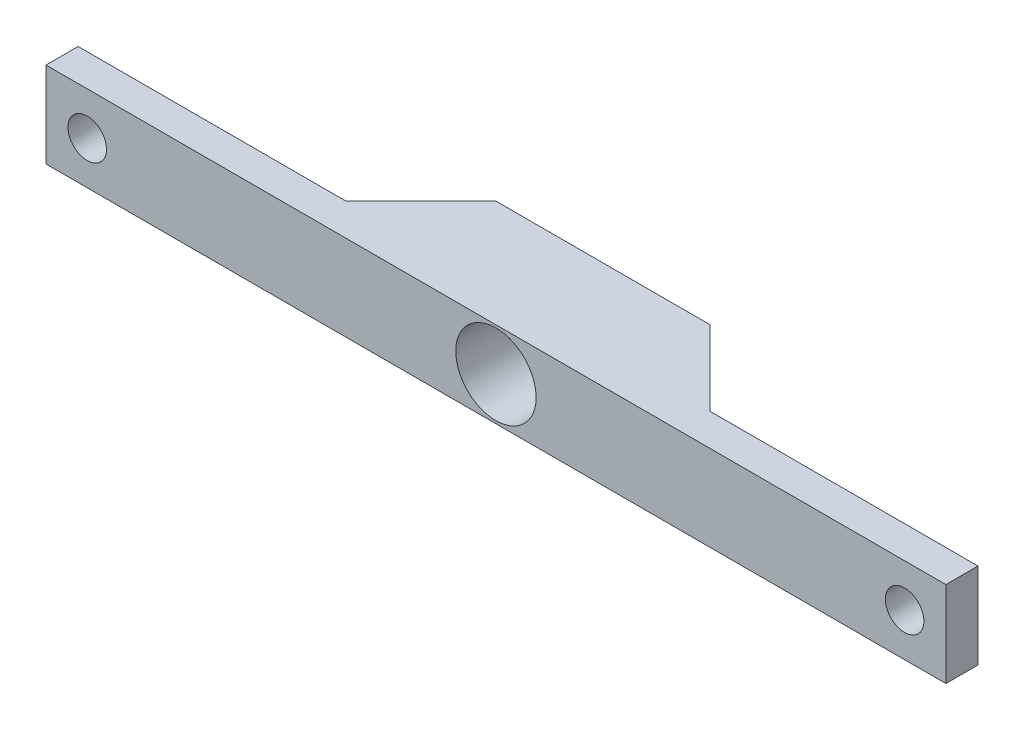
ISO-10303-21;
HEADER;
FILE_DESCRIPTION(('STEP AP214'),'2;1');
FILE_NAME('part.step','',(''),(''),'','','');
FILE_SCHEMA(('AUTOMOTIVE_DESIGN { 1 0 10303 214 1 1 1 1 }'));
ENDSEC;
DATA;
#1=APPLICATION_CONTEXT('core data for automotive mechanical design processes');
#2=APPLICATION_PROTOCOL_DEFINITION('international standard','automotive_design',2000,#1);
#3=PRODUCT_CONTEXT('',#1,'mechanical');
#4=PRODUCT('Part','Part','',(#3));
#5=PRODUCT_RELATED_PRODUCT_CATEGORY('part','',(#4));
#6=PRODUCT_DEFINITION_FORMATION('','',#4);
#7=PRODUCT_DEFINITION_CONTEXT('part definition',#1,'design');
#8=PRODUCT_DEFINITION('design','',#6,#7);
#9=PRODUCT_DEFINITION_SHAPE('','',#8);
#10=(LENGTH_UNIT() NAMED_UNIT(*) SI_UNIT(.MILLI.,.METRE.));
#11=(NAMED_UNIT(*) PLANE_ANGLE_UNIT() SI_UNIT($,.RADIAN.));
#12=(NAMED_UNIT(*) SI_UNIT($,.STERADIAN.) SOLID_ANGLE_UNIT());
#13=UNCERTAINTY_MEASURE_WITH_UNIT(LENGTH_MEASURE(1.E-05),#10,'distance_accuracy_value','');
#14=(GEOMETRIC_REPRESENTATION_CONTEXT(3) GLOBAL_UNCERTAINTY_ASSIGNED_CONTEXT((#13)) GLOBAL_UNIT_ASSIGNED_CONTEXT((#10,
#11,#12)) REPRESENTATION_CONTEXT('',''));
#15=CARTESIAN_POINT('',(0.,0.,0.));
#16=DIRECTION('',(0.,0.,1.));
#17=DIRECTION('',(1.,0.,0.));
#18=AXIS2_PLACEMENT_3D('',#15,#16,#17);
#19=CARTESIAN_POINT('',(0.,4.,10.));
#20=DIRECTION('',(0.,0.,-1.));
#21=DIRECTION('',(-1.,0.,0.));
#22=AXIS2_PLACEMENT_3D('',#19,#20,#21);
#23=CYLINDRICAL_SURFACE('',#22,1.8);
#24=CARTESIAN_POINT('',(0.,4.,0.));
#25=DIRECTION('',(0.,0.,-1.));
#26=DIRECTION('',(-1.,0.,0.));
#27=AXIS2_PLACEMENT_3D('',#24,#25,#26);
#28=CIRCLE('',#27,1.8);
#29=CARTESIAN_POINT('',(-1.8,4.,0.));
#30=VERTEX_POINT('',#29);
#31=EDGE_CURVE('E313',#30,#30,#28,.T.);
#32=CARTESIAN_POINT('',(0.,4.,4.));
#33=DIRECTION('',(0.,0.,1.));
#34=DIRECTION('',(1.,0.,0.));
#35=AXIS2_PLACEMENT_3D('',#32,#33,#34);
#36=CIRCLE('',#35,1.8);
#37=CARTESIAN_POINT('',(-1.8,4.,4.));
#38=VERTEX_POINT('',#37);
#39=EDGE_CURVE('E38',#38,#38,#36,.F.);
#40=CARTESIAN_POINT('',(-1.8,4.,0.));
#41=CARTESIAN_POINT('',(-1.8,4.,0.0416666666666667));
#42=CARTESIAN_POINT('',(-1.8,4.,0.0833333333333334));
#43=CARTESIAN_POINT('',(-1.8,4.,0.166666666666667));
#44=CARTESIAN_POINT('',(-1.8,4.,0.208333333333334));
#45=CARTESIAN_POINT('',(-1.8,4.,0.291666666666667));
#46=CARTESIAN_POINT('',(-1.8,4.,0.333333333333334));
#47=CARTESIAN_POINT('',(-1.8,4.,0.416666666666667));
#48=CARTESIAN_POINT('',(-1.8,4.,0.458333333333334));
#49=CARTESIAN_POINT('',(-1.8,4.,0.541666666666667));
#50=CARTESIAN_POINT('',(-1.8,4.,0.583333333333334));
#51=CARTESIAN_POINT('',(-1.8,4.,0.666666666666667));
#52=CARTESIAN_POINT('',(-1.8,4.,0.708333333333334));
#53=CARTESIAN_POINT('',(-1.8,4.,0.791666666666667));
#54=CARTESIAN_POINT('',(-1.8,4.,0.833333333333334));
#55=CARTESIAN_POINT('',(-1.8,4.,0.916666666666668));
#56=CARTESIAN_POINT('',(-1.8,4.,0.958333333333334));
#57=CARTESIAN_POINT('',(-1.8,4.,1.04166666666667));
#58=CARTESIAN_POINT('',(-1.8,4.,1.08333333333333));
#59=CARTESIAN_POINT('',(-1.8,4.,1.16666666666667));
#60=CARTESIAN_POINT('',(-1.8,4.,1.20833333333333));
#61=CARTESIAN_POINT('',(-1.8,4.,1.29166666666667));
#62=CARTESIAN_POINT('',(-1.8,4.,1.33333333333333));
#63=CARTESIAN_POINT('',(-1.8,4.,1.41666666666667));
#64=CARTESIAN_POINT('',(-1.8,4.,1.45833333333333));
#65=CARTESIAN_POINT('',(-1.8,4.,1.54166666666667));
#66=CARTESIAN_POINT('',(-1.8,4.,1.58333333333333));
#67=CARTESIAN_POINT('',(-1.8,4.,1.66666666666667));
#68=CARTESIAN_POINT('',(-1.8,4.,1.70833333333333));
#69=CARTESIAN_POINT('',(-1.8,4.,1.79166666666667));
#70=CARTESIAN_POINT('',(-1.8,4.,1.83333333333334));
#71=CARTESIAN_POINT('',(-1.8,4.,1.91666666666667));
#72=CARTESIAN_POINT('',(-1.8,4.,1.95833333333334));
#73=CARTESIAN_POINT('',(-1.8,4.,2.04166666666667));
#74=CARTESIAN_POINT('',(-1.8,4.,2.08333333333334));
#75=CARTESIAN_POINT('',(-1.8,4.,2.16666666666667));
#76=CARTESIAN_POINT('',(-1.8,4.,2.20833333333333));
#77=CARTESIAN_POINT('',(-1.8,4.,2.29166666666667));
#78=CARTESIAN_POINT('',(-1.8,4.,2.33333333333333));
#79=CARTESIAN_POINT('',(-1.8,4.,2.41666666666667));
#80=CARTESIAN_POINT('',(-1.8,4.,2.45833333333333));
#81=CARTESIAN_POINT('',(-1.8,4.,2.54166666666667));
#82=CARTESIAN_POINT('',(-1.8,4.,2.58333333333333));
#83=CARTESIAN_POINT('',(-1.8,4.,2.66666666666667));
#84=CARTESIAN_POINT('',(-1.8,4.,2.70833333333333));
#85=CARTESIAN_POINT('',(-1.8,4.,2.79166666666667));
#86=CARTESIAN_POINT('',(-1.8,4.,2.83333333333333));
#87=CARTESIAN_POINT('',(-1.8,4.,2.91666666666667));
#88=CARTESIAN_POINT('',(-1.8,4.,2.95833333333333));
#89=CARTESIAN_POINT('',(-1.8,4.,3.04166666666667));
#90=CARTESIAN_POINT('',(-1.8,4.,3.08333333333334));
#91=CARTESIAN_POINT('',(-1.8,4.,3.16666666666667));
#92=CARTESIAN_POINT('',(-1.8,4.,3.20833333333334));
#93=CARTESIAN_POINT('',(-1.8,4.,3.29166666666667));
#94=CARTESIAN_POINT('',(-1.8,4.,3.33333333333334));
#95=CARTESIAN_POINT('',(-1.8,4.,3.41666666666667));
#96=CARTESIAN_POINT('',(-1.8,4.,3.45833333333334));
#97=CARTESIAN_POINT('',(-1.8,4.,3.54166666666667));
#98=CARTESIAN_POINT('',(-1.8,4.,3.58333333333334));
#99=CARTESIAN_POINT('',(-1.8,4.,3.66666666666667));
#100=CARTESIAN_POINT('',(-1.8,4.,3.70833333333334));
#101=CARTESIAN_POINT('',(-1.8,4.,3.79166666666667));
#102=CARTESIAN_POINT('',(-1.8,4.,3.83333333333334));
#103=CARTESIAN_POINT('',(-1.8,4.,3.91666666666667));
#104=CARTESIAN_POINT('',(-1.8,4.,3.95833333333334));
#105=CARTESIAN_POINT('',(-1.8,4.,4.));
#106=B_SPLINE_CURVE_WITH_KNOTS('',3,(#40,#41,#42,#43,#44,#45,#46,#47,#48,#49,#50,#51,#52,#53,
#54,#55,#56,#57,#58,#59,#60,#61,#62,#63,#64,#65,#66,#67,#68,#69,#70,#71,#72,#73,#74,#75,#76,#77,
#78,#79,#80,#81,#82,#83,#84,#85,#86,#87,#88,#89,#90,#91,#92,#93,#94,#95,#96,#97,#98,#99,#100,
#101,#102,#103,#104,#105),.UNSPECIFIED.,.F.,.F.,(4,2,2,2,2,2,2,2,2,2,2,2,2,2,2,2,2,2,2,2,2,2,2,
2,2,2,2,2,2,2,2,2,4),(0.,0.125,0.25,0.375,0.5,0.625000000000001,0.750000000000001,
0.875000000000001,1.,1.125,1.25,1.375,1.5,1.625,1.75,1.875,2.,2.125,2.25,2.375,2.5,2.625,2.75,
2.875,3.,3.125,3.25,3.375,3.5,3.625,3.75,3.875,4.),.UNSPECIFIED.);
#107=EDGE_CURVE('BSEAM34',#30,#38,#106,.T.);
#108=ORIENTED_EDGE('',*,*,#31,.T.);
#109=ORIENTED_EDGE('',*,*,#39,.F.);
#110=ORIENTED_EDGE('',*,*,#107,.T.);
#111=ORIENTED_EDGE('',*,*,#107,.F.);
#112=EDGE_LOOP('',(#108,#110,#109,#111));
#113=FACE_BOUND('',#112,.T.);
#114=ADVANCED_FACE('F34',(#113),#23,.F.);
#115=CARTESIAN_POINT('',(20.,8.,10.));
#116=DIRECTION('',(0.,0.,-1.));
#117=DIRECTION('',(-1.,0.,0.));
#118=AXIS2_PLACEMENT_3D('',#115,#116,#117);
#119=PLANE('',#118);
#120=CARTESIAN_POINT('',(0.,4.,10.));
#121=DIRECTION('',(0.,0.,1.));
#122=DIRECTION('',(1.,0.,0.));
#123=AXIS2_PLACEMENT_3D('',#120,#121,#122);
#124=CIRCLE('',#123,3.75);
#125=CARTESIAN_POINT('',(3.75,4.,10.));
#126=VERTEX_POINT('',#125);
#127=EDGE_CURVE('E309',#126,#126,#124,.T.);
#128=ORIENTED_EDGE('',*,*,#127,.F.);
#129=EDGE_LOOP('',(#128));
#130=FACE_BOUND('',#129,.T.);
#131=CARTESIAN_POINT('',(-38.15,4.,10.));
#132=DIRECTION('',(0.,0.,1.));
#133=DIRECTION('',(1.,0.,0.));
#134=AXIS2_PLACEMENT_3D('',#131,#132,#133);
#135=CIRCLE('',#134,1.8);
#136=CARTESIAN_POINT('',(-36.35,4.,10.));
#137=VERTEX_POINT('',#136);
#138=EDGE_CURVE('E169',#137,#137,#135,.T.);
#139=ORIENTED_EDGE('',*,*,#138,.F.);
#140=EDGE_LOOP('',(#139));
#141=FACE_BOUND('',#140,.T.);
#142=CARTESIAN_POINT('',(38.15,4.,10.));
#143=DIRECTION('',(0.,0.,1.));
#144=DIRECTION('',(1.,0.,0.));
#145=AXIS2_PLACEMENT_3D('',#142,#143,#144);
#146=CIRCLE('',#145,1.8);
#147=CARTESIAN_POINT('',(39.95,4.,10.));
#148=VERTEX_POINT('',#147);
#149=EDGE_CURVE('E131',#148,#148,#146,.T.);
#150=ORIENTED_EDGE('',*,*,#149,.F.);
#151=EDGE_LOOP('',(#150));
#152=FACE_BOUND('',#151,.T.);
#153=DIRECTION('',(1.,0.,0.));
#154=VECTOR('',#153,1.);
#155=CARTESIAN_POINT('',(20.,0.,10.));
#156=LINE('',#155,#154);
#157=CARTESIAN_POINT('',(-42.,0.,10.));
#158=VERTEX_POINT('',#157);
#159=CARTESIAN_POINT('',(42.,0.,10.));
#160=VERTEX_POINT('',#159);
#161=EDGE_CURVE('E150',#158,#160,#156,.T.);
#162=ORIENTED_EDGE('',*,*,#161,.T.);
#163=DIRECTION('',(0.,1.,0.));
#164=VECTOR('',#163,1.);
#165=CARTESIAN_POINT('',(42.,0.,10.));
#166=LINE('',#165,#164);
#167=CARTESIAN_POINT('',(42.,8.00000000000001,10.));
#168=VERTEX_POINT('',#167);
#169=EDGE_CURVE('E128',#160,#168,#166,.T.);
#170=ORIENTED_EDGE('',*,*,#169,.T.);
#171=DIRECTION('',(1.,0.,0.));
#172=VECTOR('',#171,1.);
#173=CARTESIAN_POINT('',(20.,8.,10.));
#174=LINE('',#173,#172);
#175=CARTESIAN_POINT('',(-42.,8.,10.));
#176=VERTEX_POINT('',#175);
#177=EDGE_CURVE('E105',#176,#168,#174,.T.);
#178=ORIENTED_EDGE('',*,*,#177,.F.);
#179=DIRECTION('',(0.,-1.,0.));
#180=VECTOR('',#179,1.);
#181=CARTESIAN_POINT('',(-42.,0.,10.));
#182=LINE('',#181,#180);
#183=EDGE_CURVE('E125',#176,#158,#182,.T.);
#184=ORIENTED_EDGE('',*,*,#183,.T.);
#185=EDGE_LOOP('',(#162,#170,#178,#184));
#186=FACE_BOUND('',#185,.T.);
#187=ADVANCED_FACE('F36',(#130,#141,#152,#186),#119,.F.);
#188=CARTESIAN_POINT('',(10.,8.,0.));
#189=DIRECTION('',(-0.707106781186549,0.,0.707106781186547));
#190=DIRECTION('',(0.707106781186547,0.,0.707106781186549));
#191=AXIS2_PLACEMENT_3D('',#188,#189,#190);
#192=PLANE('',#191);
#193=DIRECTION('',(-0.707106781186547,0.,-0.707106781186549));
#194=VECTOR('',#193,1.);
#195=CARTESIAN_POINT('',(10.,8.,0.));
#196=LINE('',#195,#194);
#197=CARTESIAN_POINT('',(17.,8.,7.));
#198=VERTEX_POINT('',#197);
#199=CARTESIAN_POINT('',(10.,8.,0.));
#200=VERTEX_POINT('',#199);
#201=EDGE_CURVE('E51',#198,#200,#196,.T.);
#202=ORIENTED_EDGE('',*,*,#201,.F.);
#203=DIRECTION('',(0.,-1.,0.));
#204=VECTOR('',#203,1.);
#205=CARTESIAN_POINT('',(17.,8.,7.));
#206=LINE('',#205,#204);
#207=CARTESIAN_POINT('',(17.,0.,7.));
#208=VERTEX_POINT('',#207);
#209=EDGE_CURVE('E55',#198,#208,#206,.T.);
#210=ORIENTED_EDGE('',*,*,#209,.T.);
#211=DIRECTION('',(-0.707106781186547,0.,-0.707106781186549));
#212=VECTOR('',#211,1.);
#213=CARTESIAN_POINT('',(10.,0.,0.));
#214=LINE('',#213,#212);
#215=CARTESIAN_POINT('',(10.,0.,0.));
#216=VERTEX_POINT('',#215);
#217=EDGE_CURVE('E159',#208,#216,#214,.T.);
#218=ORIENTED_EDGE('',*,*,#217,.T.);
#219=DIRECTION('',(0.,-1.,0.));
#220=VECTOR('',#219,1.);
#221=CARTESIAN_POINT('',(10.,8.,0.));
#222=LINE('',#221,#220);
#223=EDGE_CURVE('E11',#200,#216,#222,.T.);
#224=ORIENTED_EDGE('',*,*,#223,.F.);
#225=EDGE_LOOP('',(#202,#210,#218,#224));
#226=FACE_BOUND('',#225,.T.);
#227=ADVANCED_FACE('F194',(#226),#192,.F.);
#228=CARTESIAN_POINT('',(-10.,8.,0.));
#229=DIRECTION('',(0.,0.,1.));
#230=DIRECTION('',(1.,0.,0.));
#231=AXIS2_PLACEMENT_3D('',#228,#229,#230);
#232=PLANE('',#231);
#233=ORIENTED_EDGE('',*,*,#31,.F.);
#234=EDGE_LOOP('',(#233));
#235=FACE_BOUND('',#234,.T.);
#236=DIRECTION('',(-1.,0.,0.));
#237=VECTOR('',#236,1.);
#238=CARTESIAN_POINT('',(-10.,0.,0.));
#239=LINE('',#238,#237);
#240=CARTESIAN_POINT('',(-10.,0.,0.));
#241=VERTEX_POINT('',#240);
#242=EDGE_CURVE('E161',#216,#241,#239,.T.);
#243=ORIENTED_EDGE('',*,*,#242,.T.);
#244=DIRECTION('',(0.,-1.,0.));
#245=VECTOR('',#244,1.);
#246=CARTESIAN_POINT('',(-10.,8.,0.));
#247=LINE('',#246,#245);
#248=CARTESIAN_POINT('',(-10.,8.,0.));
#249=VERTEX_POINT('',#248);
#250=EDGE_CURVE('E43',#249,#241,#247,.T.);
#251=ORIENTED_EDGE('',*,*,#250,.F.);
#252=DIRECTION('',(-1.,0.,0.));
#253=VECTOR('',#252,1.);
#254=CARTESIAN_POINT('',(-10.,8.,0.));
#255=LINE('',#254,#253);
#256=EDGE_CURVE('E154',#200,#249,#255,.T.);
#257=ORIENTED_EDGE('',*,*,#256,.F.);
#258=ORIENTED_EDGE('',*,*,#223,.T.);
#259=EDGE_LOOP('',(#243,#251,#257,#258));
#260=FACE_BOUND('',#259,.T.);
#261=ADVANCED_FACE('F193',(#235,#260),#232,.F.);
#262=CARTESIAN_POINT('',(-20.,8.,10.));
#263=DIRECTION('',(0.707106781186549,0.,0.707106781186546));
#264=DIRECTION('',(0.707106781186546,0.,-0.707106781186549));
#265=AXIS2_PLACEMENT_3D('',#262,#263,#264);
#266=PLANE('',#265);
#267=DIRECTION('',(-0.707106781186546,0.,0.707106781186549));
#268=VECTOR('',#267,1.);
#269=CARTESIAN_POINT('',(-20.,0.,10.));
#270=LINE('',#269,#268);
#271=CARTESIAN_POINT('',(-17.,0.,7.));
#272=VERTEX_POINT('',#271);
#273=EDGE_CURVE('E152',#241,#272,#270,.T.);
#274=ORIENTED_EDGE('',*,*,#273,.T.);
#275=DIRECTION('',(0.,1.,0.));
#276=VECTOR('',#275,1.);
#277=CARTESIAN_POINT('',(-17.,8.,7.));
#278=LINE('',#277,#276);
#279=CARTESIAN_POINT('',(-17.,8.,7.));
#280=VERTEX_POINT('',#279);
#281=EDGE_CURVE('E142',#272,#280,#278,.T.);
#282=ORIENTED_EDGE('',*,*,#281,.T.);
#283=DIRECTION('',(-0.707106781186546,0.,0.707106781186549));
#284=VECTOR('',#283,1.);
#285=CARTESIAN_POINT('',(-20.,8.,10.));
#286=LINE('',#285,#284);
#287=EDGE_CURVE('E156',#249,#280,#286,.T.);
#288=ORIENTED_EDGE('',*,*,#287,.F.);
#289=ORIENTED_EDGE('',*,*,#250,.T.);
#290=EDGE_LOOP('',(#274,#282,#288,#289));
#291=FACE_BOUND('',#290,.T.);
#292=ADVANCED_FACE('F189',(#291),#266,.F.);
#293=CARTESIAN_POINT('',(0.,8.,0.));
#294=DIRECTION('',(0.,-1.,0.));
#295=DIRECTION('',(0.,0.,-1.));
#296=AXIS2_PLACEMENT_3D('',#293,#294,#295);
#297=PLANE('',#296);
#298=ORIENTED_EDGE('',*,*,#287,.T.);
#299=DIRECTION('',(-1.,0.,0.));
#300=VECTOR('',#299,1.);
#301=CARTESIAN_POINT('',(-42.,8.,7.));
#302=LINE('',#301,#300);
#303=CARTESIAN_POINT('',(-42.,8.,7.));
#304=VERTEX_POINT('',#303);
#305=EDGE_CURVE('E119',#280,#304,#302,.T.);
#306=ORIENTED_EDGE('',*,*,#305,.T.);
#307=DIRECTION('',(0.,0.,1.));
#308=VECTOR('',#307,1.);
#309=CARTESIAN_POINT('',(-42.,8.,7.));
#310=LINE('',#309,#308);
#311=EDGE_CURVE('E110',#304,#176,#310,.T.);
#312=ORIENTED_EDGE('',*,*,#311,.T.);
#313=ORIENTED_EDGE('',*,*,#177,.T.);
#314=DIRECTION('',(0.,0.,1.));
#315=VECTOR('',#314,1.);
#316=CARTESIAN_POINT('',(42.,8.00000000000001,7.));
#317=LINE('',#316,#315);
#318=CARTESIAN_POINT('',(42.,8.00000000000001,7.));
#319=VERTEX_POINT('',#318);
#320=EDGE_CURVE('E99',#319,#168,#317,.T.);
#321=ORIENTED_EDGE('',*,*,#320,.F.);
#322=EDGE_CURVE('E103',#319,#198,#302,.T.);
#323=ORIENTED_EDGE('',*,*,#322,.T.);
#324=ORIENTED_EDGE('',*,*,#201,.T.);
#325=ORIENTED_EDGE('',*,*,#256,.T.);
#326=EDGE_LOOP('',(#298,#306,#312,#313,#321,#323,#324,#325));
#327=FACE_BOUND('',#326,.T.);
#328=ADVANCED_FACE('F102',(#327),#297,.F.);
#329=CARTESIAN_POINT('',(0.,0.,0.));
#330=DIRECTION('',(0.,-1.,0.));
#331=DIRECTION('',(0.,0.,-1.));
#332=AXIS2_PLACEMENT_3D('',#329,#330,#331);
#333=PLANE('',#332);
#334=ORIENTED_EDGE('',*,*,#217,.F.);
#335=DIRECTION('',(1.,0.,0.));
#336=VECTOR('',#335,1.);
#337=CARTESIAN_POINT('',(-42.,0.,7.));
#338=LINE('',#337,#336);
#339=CARTESIAN_POINT('',(42.,0.,7.));
#340=VERTEX_POINT('',#339);
#341=EDGE_CURVE('E136',#208,#340,#338,.T.);
#342=ORIENTED_EDGE('',*,*,#341,.T.);
#343=DIRECTION('',(0.,0.,1.));
#344=VECTOR('',#343,1.);
#345=CARTESIAN_POINT('',(42.,0.,7.));
#346=LINE('',#345,#344);
#347=EDGE_CURVE('E124',#340,#160,#346,.T.);
#348=ORIENTED_EDGE('',*,*,#347,.T.);
#349=ORIENTED_EDGE('',*,*,#161,.F.);
#350=DIRECTION('',(0.,0.,1.));
#351=VECTOR('',#350,1.);
#352=CARTESIAN_POINT('',(-42.,0.,7.));
#353=LINE('',#352,#351);
#354=CARTESIAN_POINT('',(-42.,0.,7.));
#355=VERTEX_POINT('',#354);
#356=EDGE_CURVE('E143',#355,#158,#353,.T.);
#357=ORIENTED_EDGE('',*,*,#356,.F.);
#358=EDGE_CURVE('E111',#355,#272,#338,.T.);
#359=ORIENTED_EDGE('',*,*,#358,.T.);
#360=ORIENTED_EDGE('',*,*,#273,.F.);
#361=ORIENTED_EDGE('',*,*,#242,.F.);
#362=EDGE_LOOP('',(#334,#342,#348,#349,#357,#359,#360,#361));
#363=FACE_BOUND('',#362,.T.);
#364=ADVANCED_FACE('F187',(#363),#333,.T.);
#365=CARTESIAN_POINT('',(-42.,0.,7.));
#366=DIRECTION('',(-1.,0.,0.));
#367=DIRECTION('',(0.,0.,1.));
#368=AXIS2_PLACEMENT_3D('',#365,#366,#367);
#369=PLANE('',#368);
#370=ORIENTED_EDGE('',*,*,#183,.F.);
#371=ORIENTED_EDGE('',*,*,#311,.F.);
#372=DIRECTION('',(0.,-1.,0.));
#373=VECTOR('',#372,1.);
#374=CARTESIAN_POINT('',(-42.,0.,7.));
#375=LINE('',#374,#373);
#376=EDGE_CURVE('E118',#304,#355,#375,.T.);
#377=ORIENTED_EDGE('',*,*,#376,.T.);
#378=ORIENTED_EDGE('',*,*,#356,.T.);
#379=EDGE_LOOP('',(#370,#371,#377,#378));
#380=FACE_BOUND('',#379,.T.);
#381=ADVANCED_FACE('F179',(#380),#369,.T.);
#382=CARTESIAN_POINT('',(0.,0.,7.));
#383=DIRECTION('',(0.,0.,-1.));
#384=DIRECTION('',(-1.,0.,0.));
#385=AXIS2_PLACEMENT_3D('',#382,#383,#384);
#386=PLANE('',#385);
#387=CARTESIAN_POINT('',(-38.15,4.,7.));
#388=DIRECTION('',(0.,0.,-1.));
#389=DIRECTION('',(-1.,0.,0.));
#390=AXIS2_PLACEMENT_3D('',#387,#388,#389);
#391=CIRCLE('',#390,1.8);
#392=CARTESIAN_POINT('',(-36.35,4.,7.));
#393=VERTEX_POINT('',#392);
#394=EDGE_CURVE('E139',#393,#393,#391,.T.);
#395=ORIENTED_EDGE('',*,*,#394,.F.);
#396=EDGE_LOOP('',(#395));
#397=FACE_BOUND('',#396,.T.);
#398=ORIENTED_EDGE('',*,*,#281,.F.);
#399=ORIENTED_EDGE('',*,*,#358,.F.);
#400=ORIENTED_EDGE('',*,*,#376,.F.);
#401=ORIENTED_EDGE('',*,*,#305,.F.);
#402=EDGE_LOOP('',(#398,#399,#400,#401));
#403=FACE_BOUND('',#402,.T.);
#404=ADVANCED_FACE('F176',(#397,#403),#386,.T.);
#405=CARTESIAN_POINT('',(38.15,4.,7.));
#406=DIRECTION('',(0.,0.,-1.));
#407=DIRECTION('',(-1.,0.,0.));
#408=AXIS2_PLACEMENT_3D('',#405,#406,#407);
#409=CIRCLE('',#408,1.8);
#410=CARTESIAN_POINT('',(39.95,4.,7.));
#411=VERTEX_POINT('',#410);
#412=EDGE_CURVE('E167',#411,#411,#409,.T.);
#413=ORIENTED_EDGE('',*,*,#412,.F.);
#414=EDGE_LOOP('',(#413));
#415=FACE_BOUND('',#414,.T.);
#416=ORIENTED_EDGE('',*,*,#209,.F.);
#417=ORIENTED_EDGE('',*,*,#322,.F.);
#418=DIRECTION('',(0.,1.,0.));
#419=VECTOR('',#418,1.);
#420=CARTESIAN_POINT('',(42.,0.,7.));
#421=LINE('',#420,#419);
#422=EDGE_CURVE('E117',#340,#319,#421,.T.);
#423=ORIENTED_EDGE('',*,*,#422,.F.);
#424=ORIENTED_EDGE('',*,*,#341,.F.);
#425=EDGE_LOOP('',(#416,#417,#423,#424));
#426=FACE_BOUND('',#425,.T.);
#427=ADVANCED_FACE('F115',(#415,#426),#386,.T.);
#428=CARTESIAN_POINT('',(42.,0.,7.));
#429=DIRECTION('',(1.,0.,0.));
#430=DIRECTION('',(0.,0.,-1.));
#431=AXIS2_PLACEMENT_3D('',#428,#429,#430);
#432=PLANE('',#431);
#433=ORIENTED_EDGE('',*,*,#169,.F.);
#434=ORIENTED_EDGE('',*,*,#347,.F.);
#435=ORIENTED_EDGE('',*,*,#422,.T.);
#436=ORIENTED_EDGE('',*,*,#320,.T.);
#437=EDGE_LOOP('',(#433,#434,#435,#436));
#438=FACE_BOUND('',#437,.T.);
#439=ADVANCED_FACE('F122',(#438),#432,.T.);
#440=CARTESIAN_POINT('',(38.15,4.,0.));
#441=DIRECTION('',(0.,0.,1.));
#442=DIRECTION('',(1.,0.,0.));
#443=AXIS2_PLACEMENT_3D('',#440,#441,#442);
#444=CYLINDRICAL_SURFACE('',#443,1.8);
#445=CARTESIAN_POINT('',(39.95,4.,7.));
#446=CARTESIAN_POINT('',(39.95,4.,7.03125));
#447=CARTESIAN_POINT('',(39.95,4.,7.0625));
#448=CARTESIAN_POINT('',(39.95,4.,7.125));
#449=CARTESIAN_POINT('',(39.95,4.,7.15625));
#450=CARTESIAN_POINT('',(39.95,4.,7.21875));
#451=CARTESIAN_POINT('',(39.95,4.,7.25));
#452=CARTESIAN_POINT('',(39.95,4.,7.3125));
#453=CARTESIAN_POINT('',(39.95,4.,7.34375));
#454=CARTESIAN_POINT('',(39.95,4.,7.40625));
#455=CARTESIAN_POINT('',(39.95,4.,7.4375));
#456=CARTESIAN_POINT('',(39.95,4.,7.5));
#457=CARTESIAN_POINT('',(39.95,4.,7.53125));
#458=CARTESIAN_POINT('',(39.95,4.,7.59375));
#459=CARTESIAN_POINT('',(39.95,4.,7.625));
#460=CARTESIAN_POINT('',(39.95,4.,7.6875));
#461=CARTESIAN_POINT('',(39.95,4.,7.71875));
#462=CARTESIAN_POINT('',(39.95,4.,7.78125));
#463=CARTESIAN_POINT('',(39.95,4.,7.8125));
#464=CARTESIAN_POINT('',(39.95,4.,7.875));
#465=CARTESIAN_POINT('',(39.95,4.,7.90625));
#466=CARTESIAN_POINT('',(39.95,4.,7.96875));
#467=CARTESIAN_POINT('',(39.95,4.,8.));
#468=CARTESIAN_POINT('',(39.95,4.,8.0625));
#469=CARTESIAN_POINT('',(39.95,4.,8.09375));
#470=CARTESIAN_POINT('',(39.95,4.,8.15625));
#471=CARTESIAN_POINT('',(39.95,4.,8.1875));
#472=CARTESIAN_POINT('',(39.95,4.,8.25));
#473=CARTESIAN_POINT('',(39.95,4.,8.28125));
#474=CARTESIAN_POINT('',(39.95,4.,8.34375));
#475=CARTESIAN_POINT('',(39.95,4.,8.375));
#476=CARTESIAN_POINT('',(39.95,4.,8.4375));
#477=CARTESIAN_POINT('',(39.95,4.,8.46875));
#478=CARTESIAN_POINT('',(39.95,4.,8.53125));
#479=CARTESIAN_POINT('',(39.95,4.,8.5625));
#480=CARTESIAN_POINT('',(39.95,4.,8.625));
#481=CARTESIAN_POINT('',(39.95,4.,8.65625));
#482=CARTESIAN_POINT('',(39.95,4.,8.71875));
#483=CARTESIAN_POINT('',(39.95,4.,8.75));
#484=CARTESIAN_POINT('',(39.95,4.,8.8125));
#485=CARTESIAN_POINT('',(39.95,4.,8.84375));
#486=CARTESIAN_POINT('',(39.95,4.,8.90625));
#487=CARTESIAN_POINT('',(39.95,4.,8.9375));
#488=CARTESIAN_POINT('',(39.95,4.,9.));
#489=CARTESIAN_POINT('',(39.95,4.,9.03125));
#490=CARTESIAN_POINT('',(39.95,4.,9.09375));
#491=CARTESIAN_POINT('',(39.95,4.,9.125));
#492=CARTESIAN_POINT('',(39.95,4.,9.1875));
#493=CARTESIAN_POINT('',(39.95,4.,9.21875));
#494=CARTESIAN_POINT('',(39.95,4.,9.28125));
#495=CARTESIAN_POINT('',(39.95,4.,9.3125));
#496=CARTESIAN_POINT('',(39.95,4.,9.375));
#497=CARTESIAN_POINT('',(39.95,4.,9.40625));
#498=CARTESIAN_POINT('',(39.95,4.,9.46875));
#499=CARTESIAN_POINT('',(39.95,4.,9.5));
#500=CARTESIAN_POINT('',(39.95,4.,9.5625));
#501=CARTESIAN_POINT('',(39.95,4.,9.59375));
#502=CARTESIAN_POINT('',(39.95,4.,9.65625));
#503=CARTESIAN_POINT('',(39.95,4.,9.6875));
#504=CARTESIAN_POINT('',(39.95,4.,9.75));
#505=CARTESIAN_POINT('',(39.95,4.,9.78125));
#506=CARTESIAN_POINT('',(39.95,4.,9.84375));
#507=CARTESIAN_POINT('',(39.95,4.,9.875));
#508=CARTESIAN_POINT('',(39.95,4.,9.9375));
#509=CARTESIAN_POINT('',(39.95,4.,9.96875));
#510=CARTESIAN_POINT('',(39.95,4.,10.));
#511=B_SPLINE_CURVE_WITH_KNOTS('',3,(#445,#446,#447,#448,#449,#450,#451,#452,#453,#454,#455,
#456,#457,#458,#459,#460,#461,#462,#463,#464,#465,#466,#467,#468,#469,#470,#471,#472,#473,#474,
#475,#476,#477,#478,#479,#480,#481,#482,#483,#484,#485,#486,#487,#488,#489,#490,#491,#492,#493,
#494,#495,#496,#497,#498,#499,#500,#501,#502,#503,#504,#505,#506,#507,#508,#509,#510),
.UNSPECIFIED.,.F.,.F.,(4,2,2,2,2,2,2,2,2,2,2,2,2,2,2,2,2,2,2,2,2,2,2,2,2,2,2,2,2,2,2,2,4),(0.,
0.0937500000000001,0.1875,0.28125,0.375,0.46875,0.5625,0.656250000000001,0.750000000000001,
0.84375,0.9375,1.03125,1.125,1.21875,1.3125,1.40625,1.5,1.59375,1.6875,1.78125,1.875,1.96875,
2.0625,2.15625,2.25,2.34375,2.4375,2.53125,2.625,2.71875,2.8125,2.90625,3.),.UNSPECIFIED.);
#512=EDGE_CURVE('BSEAM221',#411,#148,#511,.T.);
#513=ORIENTED_EDGE('',*,*,#412,.T.);
#514=ORIENTED_EDGE('',*,*,#149,.T.);
#515=ORIENTED_EDGE('',*,*,#512,.T.);
#516=ORIENTED_EDGE('',*,*,#512,.F.);
#517=EDGE_LOOP('',(#513,#515,#514,#516));
#518=FACE_BOUND('',#517,.T.);
#519=ADVANCED_FACE('F221',(#518),#444,.F.);
#520=CARTESIAN_POINT('',(-38.15,4.,0.));
#521=DIRECTION('',(0.,0.,1.));
#522=DIRECTION('',(1.,0.,0.));
#523=AXIS2_PLACEMENT_3D('',#520,#521,#522);
#524=CYLINDRICAL_SURFACE('',#523,1.8);
#525=CARTESIAN_POINT('',(-36.35,4.,7.));
#526=CARTESIAN_POINT('',(-36.35,4.,7.03125));
#527=CARTESIAN_POINT('',(-36.35,4.,7.0625));
#528=CARTESIAN_POINT('',(-36.35,4.,7.125));
#529=CARTESIAN_POINT('',(-36.35,4.,7.15625));
#530=CARTESIAN_POINT('',(-36.35,4.,7.21875));
#531=CARTESIAN_POINT('',(-36.35,4.,7.25));
#532=CARTESIAN_POINT('',(-36.35,4.,7.3125));
#533=CARTESIAN_POINT('',(-36.35,4.,7.34375));
#534=CARTESIAN_POINT('',(-36.35,4.,7.40625));
#535=CARTESIAN_POINT('',(-36.35,4.,7.4375));
#536=CARTESIAN_POINT('',(-36.35,4.,7.5));
#537=CARTESIAN_POINT('',(-36.35,4.,7.53125));
#538=CARTESIAN_POINT('',(-36.35,4.,7.59375));
#539=CARTESIAN_POINT('',(-36.35,4.,7.625));
#540=CARTESIAN_POINT('',(-36.35,4.,7.6875));
#541=CARTESIAN_POINT('',(-36.35,4.,7.71875));
#542=CARTESIAN_POINT('',(-36.35,4.,7.78125));
#543=CARTESIAN_POINT('',(-36.35,4.,7.8125));
#544=CARTESIAN_POINT('',(-36.35,4.,7.875));
#545=CARTESIAN_POINT('',(-36.35,4.,7.90625));
#546=CARTESIAN_POINT('',(-36.35,4.,7.96875));
#547=CARTESIAN_POINT('',(-36.35,4.,8.));
#548=CARTESIAN_POINT('',(-36.35,4.,8.0625));
#549=CARTESIAN_POINT('',(-36.35,4.,8.09375));
#550=CARTESIAN_POINT('',(-36.35,4.,8.15625));
#551=CARTESIAN_POINT('',(-36.35,4.,8.1875));
#552=CARTESIAN_POINT('',(-36.35,4.,8.25));
#553=CARTESIAN_POINT('',(-36.35,4.,8.28125));
#554=CARTESIAN_POINT('',(-36.35,4.,8.34375));
#555=CARTESIAN_POINT('',(-36.35,4.,8.375));
#556=CARTESIAN_POINT('',(-36.35,4.,8.4375));
#557=CARTESIAN_POINT('',(-36.35,4.,8.46875));
#558=CARTESIAN_POINT('',(-36.35,4.,8.53125));
#559=CARTESIAN_POINT('',(-36.35,4.,8.5625));
#560=CARTESIAN_POINT('',(-36.35,4.,8.625));
#561=CARTESIAN_POINT('',(-36.35,4.,8.65625));
#562=CARTESIAN_POINT('',(-36.35,4.,8.71875));
#563=CARTESIAN_POINT('',(-36.35,4.,8.75));
#564=CARTESIAN_POINT('',(-36.35,4.,8.8125));
#565=CARTESIAN_POINT('',(-36.35,4.,8.84375));
#566=CARTESIAN_POINT('',(-36.35,4.,8.90625));
#567=CARTESIAN_POINT('',(-36.35,4.,8.9375));
#568=CARTESIAN_POINT('',(-36.35,4.,9.));
#569=CARTESIAN_POINT('',(-36.35,4.,9.03125));
#570=CARTESIAN_POINT('',(-36.35,4.,9.09375));
#571=CARTESIAN_POINT('',(-36.35,4.,9.125));
#572=CARTESIAN_POINT('',(-36.35,4.,9.1875));
#573=CARTESIAN_POINT('',(-36.35,4.,9.21875));
#574=CARTESIAN_POINT('',(-36.35,4.,9.28125));
#575=CARTESIAN_POINT('',(-36.35,4.,9.3125));
#576=CARTESIAN_POINT('',(-36.35,4.,9.375));
#577=CARTESIAN_POINT('',(-36.35,4.,9.40625));
#578=CARTESIAN_POINT('',(-36.35,4.,9.46875));
#579=CARTESIAN_POINT('',(-36.35,4.,9.5));
#580=CARTESIAN_POINT('',(-36.35,4.,9.5625));
#581=CARTESIAN_POINT('',(-36.35,4.,9.59375));
#582=CARTESIAN_POINT('',(-36.35,4.,9.65625));
#583=CARTESIAN_POINT('',(-36.35,4.,9.6875));
#584=CARTESIAN_POINT('',(-36.35,4.,9.75));
#585=CARTESIAN_POINT('',(-36.35,4.,9.78125));
#586=CARTESIAN_POINT('',(-36.35,4.,9.84375));
#587=CARTESIAN_POINT('',(-36.35,4.,9.875));
#588=CARTESIAN_POINT('',(-36.35,4.,9.9375));
#589=CARTESIAN_POINT('',(-36.35,4.,9.96875));
#590=CARTESIAN_POINT('',(-36.35,4.,10.));
#591=B_SPLINE_CURVE_WITH_KNOTS('',3,(#525,#526,#527,#528,#529,#530,#531,#532,#533,#534,#535,
#536,#537,#538,#539,#540,#541,#542,#543,#544,#545,#546,#547,#548,#549,#550,#551,#552,#553,#554,
#555,#556,#557,#558,#559,#560,#561,#562,#563,#564,#565,#566,#567,#568,#569,#570,#571,#572,#573,
#574,#575,#576,#577,#578,#579,#580,#581,#582,#583,#584,#585,#586,#587,#588,#589,#590),
.UNSPECIFIED.,.F.,.F.,(4,2,2,2,2,2,2,2,2,2,2,2,2,2,2,2,2,2,2,2,2,2,2,2,2,2,2,2,2,2,2,2,4),(0.,
0.0937500000000001,0.1875,0.28125,0.375,0.46875,0.5625,0.656250000000001,0.750000000000001,
0.84375,0.9375,1.03125,1.125,1.21875,1.3125,1.40625,1.5,1.59375,1.6875,1.78125,1.875,1.96875,
2.0625,2.15625,2.25,2.34375,2.4375,2.53125,2.625,2.71875,2.8125,2.90625,3.),.UNSPECIFIED.);
#592=EDGE_CURVE('BSEAM173',#393,#137,#591,.T.);
#593=ORIENTED_EDGE('',*,*,#394,.T.);
#594=ORIENTED_EDGE('',*,*,#138,.T.);
#595=ORIENTED_EDGE('',*,*,#592,.T.);
#596=ORIENTED_EDGE('',*,*,#592,.F.);
#597=EDGE_LOOP('',(#593,#595,#594,#596));
#598=FACE_BOUND('',#597,.T.);
#599=ADVANCED_FACE('F173',(#598),#524,.F.);
#600=CARTESIAN_POINT('',(0.,4.,4.));
#601=DIRECTION('',(0.,0.,1.));
#602=DIRECTION('',(1.,0.,0.));
#603=AXIS2_PLACEMENT_3D('',#600,#601,#602);
#604=PLANE('',#603);
#605=CARTESIAN_POINT('',(0.,4.,4.));
#606=DIRECTION('',(0.,0.,1.));
#607=DIRECTION('',(1.,0.,0.));
#608=AXIS2_PLACEMENT_3D('',#605,#606,#607);
#609=CIRCLE('',#608,3.75);
#610=CARTESIAN_POINT('',(3.75,4.,4.));
#611=VERTEX_POINT('',#610);
#612=EDGE_CURVE('E306',#611,#611,#609,.T.);
#613=ORIENTED_EDGE('',*,*,#612,.T.);
#614=EDGE_LOOP('',(#613));
#615=FACE_BOUND('',#614,.T.);
#616=ORIENTED_EDGE('',*,*,#39,.T.);
#617=EDGE_LOOP('',(#616));
#618=FACE_BOUND('',#617,.T.);
#619=ADVANCED_FACE('F220',(#615,#618),#604,.T.);
#620=CARTESIAN_POINT('',(0.,4.,4.));
#621=DIRECTION('',(0.,0.,1.));
#622=DIRECTION('',(1.,0.,0.));
#623=AXIS2_PLACEMENT_3D('',#620,#621,#622);
#624=CYLINDRICAL_SURFACE('',#623,3.75);
#625=ORIENTED_EDGE('',*,*,#612,.F.);
#626=EDGE_LOOP('',(#625));
#627=FACE_BOUND('',#626,.T.);
#628=ORIENTED_EDGE('',*,*,#127,.T.);
#629=EDGE_LOOP('',(#628));
#630=FACE_BOUND('',#629,.T.);
#631=ADVANCED_FACE('F216',(#627,#630),#624,.F.);
#632=CLOSED_SHELL('',(#114,#187,#227,#261,#292,#328,#364,#381,#404,#427,#439,#519,#599,#619,#631));
#633=MANIFOLD_SOLID_BREP('B2',#632);
#634=ADVANCED_BREP_SHAPE_REPRESENTATION('',(#18,#633),#14);
#635=SHAPE_DEFINITION_REPRESENTATION(#9,#634);
ENDSEC;
END-ISO-10303-21;
